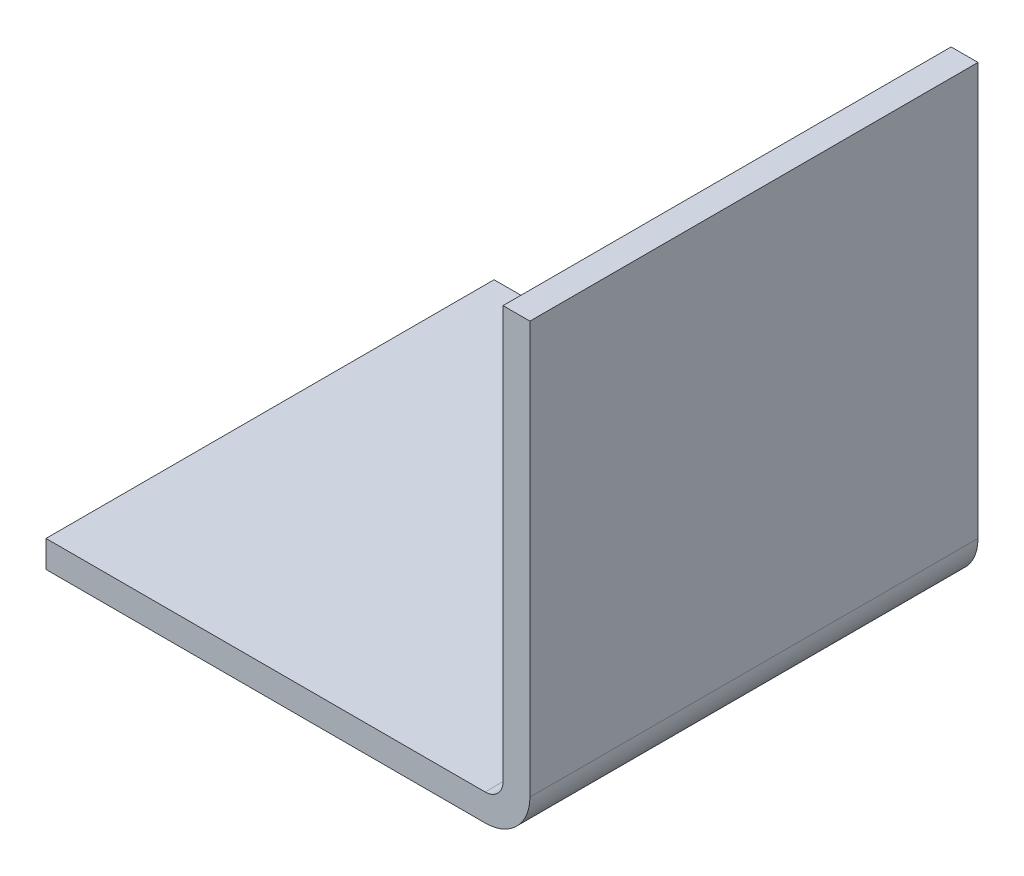
ISO-10303-21;
HEADER;
FILE_DESCRIPTION(('STEP AP214'),'2;1');
FILE_NAME('part.step','',(''),(''),'','','');
FILE_SCHEMA(('AUTOMOTIVE_DESIGN { 1 0 10303 214 1 1 1 1 }'));
ENDSEC;
DATA;
#1=APPLICATION_CONTEXT('core data for automotive mechanical design processes');
#2=APPLICATION_PROTOCOL_DEFINITION('international standard','automotive_design',2000,#1);
#3=PRODUCT_CONTEXT('',#1,'mechanical');
#4=PRODUCT('Part','Part','',(#3));
#5=PRODUCT_RELATED_PRODUCT_CATEGORY('part','',(#4));
#6=PRODUCT_DEFINITION_FORMATION('','',#4);
#7=PRODUCT_DEFINITION_CONTEXT('part definition',#1,'design');
#8=PRODUCT_DEFINITION('design','',#6,#7);
#9=PRODUCT_DEFINITION_SHAPE('','',#8);
#10=(LENGTH_UNIT() NAMED_UNIT(*) SI_UNIT(.MILLI.,.METRE.));
#11=(NAMED_UNIT(*) PLANE_ANGLE_UNIT() SI_UNIT($,.RADIAN.));
#12=(NAMED_UNIT(*) SI_UNIT($,.STERADIAN.) SOLID_ANGLE_UNIT());
#13=UNCERTAINTY_MEASURE_WITH_UNIT(LENGTH_MEASURE(1.E-05),#10,'distance_accuracy_value','');
#14=(GEOMETRIC_REPRESENTATION_CONTEXT(3) GLOBAL_UNCERTAINTY_ASSIGNED_CONTEXT((#13)) GLOBAL_UNIT_ASSIGNED_CONTEXT((#10,
#11,#12)) REPRESENTATION_CONTEXT('',''));
#15=CARTESIAN_POINT('',(0.,0.,0.));
#16=DIRECTION('',(0.,0.,1.));
#17=DIRECTION('',(1.,0.,0.));
#18=AXIS2_PLACEMENT_3D('',#15,#16,#17);
#19=CARTESIAN_POINT('',(-5.00000000000004,3.,50.));
#20=DIRECTION('',(0.,-1.,0.));
#21=DIRECTION('',(0.,0.,-1.));
#22=AXIS2_PLACEMENT_3D('',#19,#20,#21);
#23=PLANE('',#22);
#24=DIRECTION('',(1.,0.,0.));
#25=VECTOR('',#24,1.);
#26=CARTESIAN_POINT('',(-5.00000000000004,3.,0.));
#27=LINE('',#26,#25);
#28=CARTESIAN_POINT('',(-5.00000000000003,3.,0.));
#29=VERTEX_POINT('',#28);
#30=CARTESIAN_POINT('',(-54.,3.,0.));
#31=VERTEX_POINT('',#30);
#32=EDGE_CURVE('E130',#29,#31,#27,.F.);
#33=ORIENTED_EDGE('',*,*,#32,.T.);
#34=DIRECTION('',(0.,0.,-1.));
#35=VECTOR('',#34,1.);
#36=CARTESIAN_POINT('',(-54.,3.,50.));
#37=LINE('',#36,#35);
#38=CARTESIAN_POINT('',(-54.,3.,50.));
#39=VERTEX_POINT('',#38);
#40=EDGE_CURVE('E11',#39,#31,#37,.T.);
#41=ORIENTED_EDGE('',*,*,#40,.F.);
#42=DIRECTION('',(1.,0.,0.));
#43=VECTOR('',#42,1.);
#44=CARTESIAN_POINT('',(-5.00000000000004,3.,50.));
#45=LINE('',#44,#43);
#46=CARTESIAN_POINT('',(-5.00000000000003,3.,50.));
#47=VERTEX_POINT('',#46);
#48=EDGE_CURVE('E88',#47,#39,#45,.F.);
#49=ORIENTED_EDGE('',*,*,#48,.F.);
#50=DIRECTION('',(0.,0.,-1.));
#51=VECTOR('',#50,1.);
#52=CARTESIAN_POINT('',(-5.00000000000003,3.,50.));
#53=LINE('',#52,#51);
#54=EDGE_CURVE('E129',#47,#29,#53,.T.);
#55=ORIENTED_EDGE('',*,*,#54,.T.);
#56=EDGE_LOOP('',(#33,#41,#49,#55));
#57=FACE_BOUND('',#56,.T.);
#58=ADVANCED_FACE('F33',(#57),#23,.F.);
#59=CARTESIAN_POINT('',(-54.,0.,50.));
#60=DIRECTION('',(-1.,0.,0.));
#61=DIRECTION('',(0.,-1.,0.));
#62=AXIS2_PLACEMENT_3D('',#59,#60,#61);
#63=PLANE('',#62);
#64=DIRECTION('',(0.,1.,0.));
#65=VECTOR('',#64,1.);
#66=CARTESIAN_POINT('',(-54.,0.,0.));
#67=LINE('',#66,#65);
#68=CARTESIAN_POINT('',(-54.,0.,0.));
#69=VERTEX_POINT('',#68);
#70=EDGE_CURVE('E133',#69,#31,#67,.T.);
#71=ORIENTED_EDGE('',*,*,#70,.F.);
#72=DIRECTION('',(0.,0.,-1.));
#73=VECTOR('',#72,1.);
#74=CARTESIAN_POINT('',(-54.,0.,50.));
#75=LINE('',#74,#73);
#76=CARTESIAN_POINT('',(-54.,0.,50.));
#77=VERTEX_POINT('',#76);
#78=EDGE_CURVE('E41',#77,#69,#75,.T.);
#79=ORIENTED_EDGE('',*,*,#78,.F.);
#80=DIRECTION('',(0.,1.,0.));
#81=VECTOR('',#80,1.);
#82=CARTESIAN_POINT('',(-54.,0.,50.));
#83=LINE('',#82,#81);
#84=EDGE_CURVE('E172',#77,#39,#83,.T.);
#85=ORIENTED_EDGE('',*,*,#84,.T.);
#86=ORIENTED_EDGE('',*,*,#40,.T.);
#87=EDGE_LOOP('',(#71,#79,#85,#86));
#88=FACE_BOUND('',#87,.T.);
#89=ADVANCED_FACE('F163',(#88),#63,.T.);
#90=CARTESIAN_POINT('',(-5.00000000000004,0.,50.));
#91=DIRECTION('',(0.,-1.,0.));
#92=DIRECTION('',(0.,0.,-1.));
#93=AXIS2_PLACEMENT_3D('',#90,#91,#92);
#94=PLANE('',#93);
#95=DIRECTION('',(-1.,0.,0.));
#96=VECTOR('',#95,1.);
#97=CARTESIAN_POINT('',(-5.00000000000004,0.,0.));
#98=LINE('',#97,#96);
#99=CARTESIAN_POINT('',(-5.00000000000003,0.,0.));
#100=VERTEX_POINT('',#99);
#101=EDGE_CURVE('E136',#100,#69,#98,.T.);
#102=ORIENTED_EDGE('',*,*,#101,.F.);
#103=DIRECTION('',(0.,0.,-1.));
#104=VECTOR('',#103,1.);
#105=CARTESIAN_POINT('',(-5.00000000000003,0.,50.));
#106=LINE('',#105,#104);
#107=CARTESIAN_POINT('',(-5.00000000000003,0.,50.));
#108=VERTEX_POINT('',#107);
#109=EDGE_CURVE('E153',#108,#100,#106,.T.);
#110=ORIENTED_EDGE('',*,*,#109,.F.);
#111=DIRECTION('',(-1.,0.,0.));
#112=VECTOR('',#111,1.);
#113=CARTESIAN_POINT('',(-5.00000000000004,0.,50.));
#114=LINE('',#113,#112);
#115=EDGE_CURVE('E160',#108,#77,#114,.T.);
#116=ORIENTED_EDGE('',*,*,#115,.T.);
#117=ORIENTED_EDGE('',*,*,#78,.T.);
#118=EDGE_LOOP('',(#102,#110,#116,#117));
#119=FACE_BOUND('',#118,.T.);
#120=ADVANCED_FACE('F158',(#119),#94,.T.);
#121=CARTESIAN_POINT('',(-5.,5.,50.));
#122=DIRECTION('',(0.,0.,-1.));
#123=DIRECTION('',(-1.,0.,0.));
#124=AXIS2_PLACEMENT_3D('',#121,#122,#123);
#125=CYLINDRICAL_SURFACE('',#124,5.);
#126=CARTESIAN_POINT('',(-5.,5.,0.));
#127=DIRECTION('',(0.,0.,-1.));
#128=DIRECTION('',(-1.,0.,0.));
#129=AXIS2_PLACEMENT_3D('',#126,#127,#128);
#130=CIRCLE('',#129,5.);
#131=CARTESIAN_POINT('',(0.,5.00000000000004,0.));
#132=VERTEX_POINT('',#131);
#133=EDGE_CURVE('E139',#132,#100,#130,.T.);
#134=ORIENTED_EDGE('',*,*,#133,.F.);
#135=DIRECTION('',(0.,0.,-1.));
#136=VECTOR('',#135,1.);
#137=CARTESIAN_POINT('',(0.,5.00000000000004,50.));
#138=LINE('',#137,#136);
#139=CARTESIAN_POINT('',(0.,5.00000000000004,50.));
#140=VERTEX_POINT('',#139);
#141=EDGE_CURVE('E151',#140,#132,#138,.T.);
#142=ORIENTED_EDGE('',*,*,#141,.F.);
#143=CARTESIAN_POINT('',(-5.,5.,50.));
#144=DIRECTION('',(0.,0.,-1.));
#145=DIRECTION('',(-1.,0.,0.));
#146=AXIS2_PLACEMENT_3D('',#143,#144,#145);
#147=CIRCLE('',#146,5.);
#148=EDGE_CURVE('E124',#140,#108,#147,.T.);
#149=ORIENTED_EDGE('',*,*,#148,.T.);
#150=ORIENTED_EDGE('',*,*,#109,.T.);
#151=EDGE_LOOP('',(#134,#142,#149,#150));
#152=FACE_BOUND('',#151,.T.);
#153=ADVANCED_FACE('F170',(#152),#125,.T.);
#154=CARTESIAN_POINT('',(0.,51.,50.));
#155=DIRECTION('',(1.,0.,0.));
#156=DIRECTION('',(0.,1.,0.));
#157=AXIS2_PLACEMENT_3D('',#154,#155,#156);
#158=PLANE('',#157);
#159=DIRECTION('',(0.,-1.,0.));
#160=VECTOR('',#159,1.);
#161=CARTESIAN_POINT('',(0.,51.,0.));
#162=LINE('',#161,#160);
#163=CARTESIAN_POINT('',(0.,51.,0.));
#164=VERTEX_POINT('',#163);
#165=EDGE_CURVE('E142',#164,#132,#162,.T.);
#166=ORIENTED_EDGE('',*,*,#165,.F.);
#167=DIRECTION('',(0.,0.,-1.));
#168=VECTOR('',#167,1.);
#169=CARTESIAN_POINT('',(0.,51.,50.));
#170=LINE('',#169,#168);
#171=CARTESIAN_POINT('',(0.,51.,50.));
#172=VERTEX_POINT('',#171);
#173=EDGE_CURVE('E112',#172,#164,#170,.T.);
#174=ORIENTED_EDGE('',*,*,#173,.F.);
#175=DIRECTION('',(0.,-1.,0.));
#176=VECTOR('',#175,1.);
#177=CARTESIAN_POINT('',(0.,51.,50.));
#178=LINE('',#177,#176);
#179=EDGE_CURVE('E122',#172,#140,#178,.T.);
#180=ORIENTED_EDGE('',*,*,#179,.T.);
#181=ORIENTED_EDGE('',*,*,#141,.T.);
#182=EDGE_LOOP('',(#166,#174,#180,#181));
#183=FACE_BOUND('',#182,.T.);
#184=ADVANCED_FACE('F177',(#183),#158,.T.);
#185=CARTESIAN_POINT('',(-3.,51.,50.));
#186=DIRECTION('',(0.,1.,0.));
#187=DIRECTION('',(0.,0.,1.));
#188=AXIS2_PLACEMENT_3D('',#185,#186,#187);
#189=PLANE('',#188);
#190=DIRECTION('',(1.,0.,0.));
#191=VECTOR('',#190,1.);
#192=CARTESIAN_POINT('',(-3.,51.,0.));
#193=LINE('',#192,#191);
#194=CARTESIAN_POINT('',(-3.,51.,0.));
#195=VERTEX_POINT('',#194);
#196=EDGE_CURVE('E111',#195,#164,#193,.T.);
#197=ORIENTED_EDGE('',*,*,#196,.F.);
#198=DIRECTION('',(0.,0.,-1.));
#199=VECTOR('',#198,1.);
#200=CARTESIAN_POINT('',(-3.,51.,50.));
#201=LINE('',#200,#199);
#202=CARTESIAN_POINT('',(-3.,51.,50.));
#203=VERTEX_POINT('',#202);
#204=EDGE_CURVE('E105',#203,#195,#201,.T.);
#205=ORIENTED_EDGE('',*,*,#204,.F.);
#206=DIRECTION('',(1.,0.,0.));
#207=VECTOR('',#206,1.);
#208=CARTESIAN_POINT('',(-3.,51.,50.));
#209=LINE('',#208,#207);
#210=EDGE_CURVE('E109',#203,#172,#209,.T.);
#211=ORIENTED_EDGE('',*,*,#210,.T.);
#212=ORIENTED_EDGE('',*,*,#173,.T.);
#213=EDGE_LOOP('',(#197,#205,#211,#212));
#214=FACE_BOUND('',#213,.T.);
#215=ADVANCED_FACE('F107',(#214),#189,.T.);
#216=CARTESIAN_POINT('',(-3.,51.,50.));
#217=DIRECTION('',(1.,0.,0.));
#218=DIRECTION('',(0.,1.,0.));
#219=AXIS2_PLACEMENT_3D('',#216,#217,#218);
#220=PLANE('',#219);
#221=DIRECTION('',(0.,-1.,0.));
#222=VECTOR('',#221,1.);
#223=CARTESIAN_POINT('',(-3.,51.,0.));
#224=LINE('',#223,#222);
#225=CARTESIAN_POINT('',(-3.,5.00000000000001,0.));
#226=VERTEX_POINT('',#225);
#227=EDGE_CURVE('E76',#195,#226,#224,.T.);
#228=ORIENTED_EDGE('',*,*,#227,.T.);
#229=DIRECTION('',(0.,0.,-1.));
#230=VECTOR('',#229,1.);
#231=CARTESIAN_POINT('',(-3.,5.00000000000001,50.));
#232=LINE('',#231,#230);
#233=CARTESIAN_POINT('',(-3.,5.00000000000001,50.));
#234=VERTEX_POINT('',#233);
#235=EDGE_CURVE('E113',#234,#226,#232,.T.);
#236=ORIENTED_EDGE('',*,*,#235,.F.);
#237=DIRECTION('',(0.,-1.,0.));
#238=VECTOR('',#237,1.);
#239=CARTESIAN_POINT('',(-3.,51.,50.));
#240=LINE('',#239,#238);
#241=EDGE_CURVE('E115',#203,#234,#240,.T.);
#242=ORIENTED_EDGE('',*,*,#241,.F.);
#243=ORIENTED_EDGE('',*,*,#204,.T.);
#244=EDGE_LOOP('',(#228,#236,#242,#243));
#245=FACE_BOUND('',#244,.T.);
#246=ADVANCED_FACE('F116',(#245),#220,.F.);
#247=CARTESIAN_POINT('',(-5.,5.,50.));
#248=DIRECTION('',(0.,0.,-1.));
#249=DIRECTION('',(-1.,0.,0.));
#250=AXIS2_PLACEMENT_3D('',#247,#248,#249);
#251=CYLINDRICAL_SURFACE('',#250,2.);
#252=CARTESIAN_POINT('',(-5.,5.,0.));
#253=DIRECTION('',(0.,0.,1.));
#254=DIRECTION('',(1.,0.,0.));
#255=AXIS2_PLACEMENT_3D('',#252,#253,#254);
#256=CIRCLE('',#255,2.);
#257=EDGE_CURVE('E82',#226,#29,#256,.F.);
#258=ORIENTED_EDGE('',*,*,#257,.T.);
#259=ORIENTED_EDGE('',*,*,#54,.F.);
#260=CARTESIAN_POINT('',(-5.,5.,50.));
#261=DIRECTION('',(0.,0.,1.));
#262=DIRECTION('',(1.,0.,0.));
#263=AXIS2_PLACEMENT_3D('',#260,#261,#262);
#264=CIRCLE('',#263,2.);
#265=EDGE_CURVE('E49',#234,#47,#264,.F.);
#266=ORIENTED_EDGE('',*,*,#265,.F.);
#267=ORIENTED_EDGE('',*,*,#235,.T.);
#268=EDGE_LOOP('',(#258,#259,#266,#267));
#269=FACE_BOUND('',#268,.T.);
#270=ADVANCED_FACE('F179',(#269),#251,.F.);
#271=CARTESIAN_POINT('',(-5.,5.,50.));
#272=DIRECTION('',(0.,0.,-1.));
#273=DIRECTION('',(-1.,0.,0.));
#274=AXIS2_PLACEMENT_3D('',#271,#272,#273);
#275=PLANE('',#274);
#276=ORIENTED_EDGE('',*,*,#48,.T.);
#277=ORIENTED_EDGE('',*,*,#84,.F.);
#278=ORIENTED_EDGE('',*,*,#115,.F.);
#279=ORIENTED_EDGE('',*,*,#148,.F.);
#280=ORIENTED_EDGE('',*,*,#179,.F.);
#281=ORIENTED_EDGE('',*,*,#210,.F.);
#282=ORIENTED_EDGE('',*,*,#241,.T.);
#283=ORIENTED_EDGE('',*,*,#265,.T.);
#284=EDGE_LOOP('',(#276,#277,#278,#279,#280,#281,#282,#283));
#285=FACE_BOUND('',#284,.T.);
#286=ADVANCED_FACE('F119',(#285),#275,.F.);
#287=CARTESIAN_POINT('',(-5.,5.,0.));
#288=DIRECTION('',(0.,0.,-1.));
#289=DIRECTION('',(-1.,0.,0.));
#290=AXIS2_PLACEMENT_3D('',#287,#288,#289);
#291=PLANE('',#290);
#292=ORIENTED_EDGE('',*,*,#32,.F.);
#293=ORIENTED_EDGE('',*,*,#257,.F.);
#294=ORIENTED_EDGE('',*,*,#227,.F.);
#295=ORIENTED_EDGE('',*,*,#196,.T.);
#296=ORIENTED_EDGE('',*,*,#165,.T.);
#297=ORIENTED_EDGE('',*,*,#133,.T.);
#298=ORIENTED_EDGE('',*,*,#101,.T.);
#299=ORIENTED_EDGE('',*,*,#70,.T.);
#300=EDGE_LOOP('',(#292,#293,#294,#295,#296,#297,#298,#299));
#301=FACE_BOUND('',#300,.T.);
#302=ADVANCED_FACE('F166',(#301),#291,.T.);
#303=CLOSED_SHELL('',(#58,#89,#120,#153,#184,#215,#246,#270,#286,#302));
#304=MANIFOLD_SOLID_BREP('B2',#303);
#305=ADVANCED_BREP_SHAPE_REPRESENTATION('',(#18,#304),#14);
#306=SHAPE_DEFINITION_REPRESENTATION(#9,#305);
ENDSEC;
END-ISO-10303-21;
